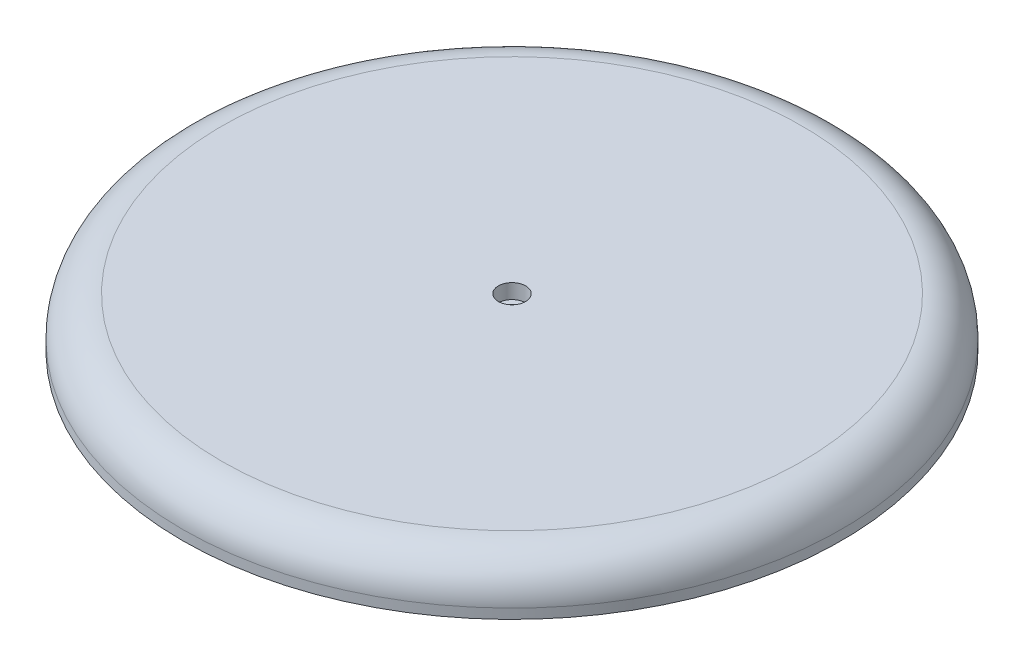
ISO-10303-21;
HEADER;
FILE_DESCRIPTION(('STEP AP214'),'2;1');
FILE_NAME('part.step','',(''),(''),'','','');
FILE_SCHEMA(('AUTOMOTIVE_DESIGN { 1 0 10303 214 1 1 1 1 }'));
ENDSEC;
DATA;
#1=APPLICATION_CONTEXT('core data for automotive mechanical design processes');
#2=APPLICATION_PROTOCOL_DEFINITION('international standard','automotive_design',2000,#1);
#3=PRODUCT_CONTEXT('',#1,'mechanical');
#4=PRODUCT('Part','Part','',(#3));
#5=PRODUCT_RELATED_PRODUCT_CATEGORY('part','',(#4));
#6=PRODUCT_DEFINITION_FORMATION('','',#4);
#7=PRODUCT_DEFINITION_CONTEXT('part definition',#1,'design');
#8=PRODUCT_DEFINITION('design','',#6,#7);
#9=PRODUCT_DEFINITION_SHAPE('','',#8);
#10=(LENGTH_UNIT() NAMED_UNIT(*) SI_UNIT(.MILLI.,.METRE.));
#11=(NAMED_UNIT(*) PLANE_ANGLE_UNIT() SI_UNIT($,.RADIAN.));
#12=(NAMED_UNIT(*) SI_UNIT($,.STERADIAN.) SOLID_ANGLE_UNIT());
#13=UNCERTAINTY_MEASURE_WITH_UNIT(LENGTH_MEASURE(1.E-05),#10,'distance_accuracy_value','');
#14=(GEOMETRIC_REPRESENTATION_CONTEXT(3) GLOBAL_UNCERTAINTY_ASSIGNED_CONTEXT((#13)) GLOBAL_UNIT_ASSIGNED_CONTEXT((#10,
#11,#12)) REPRESENTATION_CONTEXT('',''));
#15=CARTESIAN_POINT('',(0.,0.,0.));
#16=DIRECTION('',(0.,0.,1.));
#17=DIRECTION('',(1.,0.,0.));
#18=AXIS2_PLACEMENT_3D('',#15,#16,#17);
#19=CARTESIAN_POINT('',(0.,10.,0.));
#20=DIRECTION('',(0.,-1.,0.));
#21=DIRECTION('',(0.,0.,-1.));
#22=AXIS2_PLACEMENT_3D('',#19,#20,#21);
#23=CYLINDRICAL_SURFACE('',#22,67.15);
#24=CARTESIAN_POINT('',(0.,2.,0.));
#25=DIRECTION('',(0.,1.,0.));
#26=DIRECTION('',(0.,0.,1.));
#27=AXIS2_PLACEMENT_3D('',#24,#25,#26);
#28=CIRCLE('',#27,67.15);
#29=CARTESIAN_POINT('',(0.,2.,67.15));
#30=VERTEX_POINT('',#29);
#31=EDGE_CURVE('E10',#30,#30,#28,.F.);
#32=ORIENTED_EDGE('',*,*,#31,.T.);
#33=EDGE_LOOP('',(#32));
#34=FACE_BOUND('',#33,.T.);
#35=CARTESIAN_POINT('',(0.,0.,0.));
#36=DIRECTION('',(0.,1.,0.));
#37=DIRECTION('',(0.,0.,1.));
#38=AXIS2_PLACEMENT_3D('',#35,#36,#37);
#39=CIRCLE('',#38,67.15);
#40=CARTESIAN_POINT('',(0.,0.,67.15));
#41=VERTEX_POINT('',#40);
#42=EDGE_CURVE('E50',#41,#41,#39,.T.);
#43=ORIENTED_EDGE('',*,*,#42,.T.);
#44=EDGE_LOOP('',(#43));
#45=FACE_BOUND('',#44,.T.);
#46=ADVANCED_FACE('F37',(#34,#45),#23,.T.);
#47=CARTESIAN_POINT('',(0.,10.,0.));
#48=DIRECTION('',(0.,1.,0.));
#49=DIRECTION('',(0.,0.,1.));
#50=AXIS2_PLACEMENT_3D('',#47,#48,#49);
#51=PLANE('',#50);
#52=CARTESIAN_POINT('',(0.,10.,0.));
#53=DIRECTION('',(0.,1.,0.));
#54=DIRECTION('',(0.,0.,1.));
#55=AXIS2_PLACEMENT_3D('',#52,#53,#54);
#56=CIRCLE('',#55,2.775);
#57=CARTESIAN_POINT('',(0.,10.,2.775));
#58=VERTEX_POINT('',#57);
#59=EDGE_CURVE('E66',#58,#58,#56,.T.);
#60=ORIENTED_EDGE('',*,*,#59,.F.);
#61=EDGE_LOOP('',(#60));
#62=FACE_BOUND('',#61,.T.);
#63=CARTESIAN_POINT('',(0.,10.,0.));
#64=DIRECTION('',(0.,1.,0.));
#65=DIRECTION('',(0.,0.,1.));
#66=AXIS2_PLACEMENT_3D('',#63,#64,#65);
#67=CIRCLE('',#66,59.15);
#68=CARTESIAN_POINT('',(0.,10.,59.15));
#69=VERTEX_POINT('',#68);
#70=EDGE_CURVE('E45',#69,#69,#67,.T.);
#71=ORIENTED_EDGE('',*,*,#70,.T.);
#72=EDGE_LOOP('',(#71));
#73=FACE_BOUND('',#72,.T.);
#74=ADVANCED_FACE('F97',(#62,#73),#51,.T.);
#75=CARTESIAN_POINT('',(0.,0.,0.));
#76=DIRECTION('',(0.,1.,0.));
#77=DIRECTION('',(0.,0.,1.));
#78=AXIS2_PLACEMENT_3D('',#75,#76,#77);
#79=PLANE('',#78);
#80=CARTESIAN_POINT('',(0.,0.,0.));
#81=DIRECTION('',(0.,1.,0.));
#82=DIRECTION('',(0.,0.,1.));
#83=AXIS2_PLACEMENT_3D('',#80,#81,#82);
#84=CIRCLE('',#83,30.48);
#85=CARTESIAN_POINT('',(0.,0.,30.48));
#86=VERTEX_POINT('',#85);
#87=EDGE_CURVE('E58',#86,#86,#84,.T.);
#88=ORIENTED_EDGE('',*,*,#87,.T.);
#89=EDGE_LOOP('',(#88));
#90=FACE_BOUND('',#89,.T.);
#91=ORIENTED_EDGE('',*,*,#42,.F.);
#92=EDGE_LOOP('',(#91));
#93=FACE_BOUND('',#92,.T.);
#94=ADVANCED_FACE('F99',(#90,#93),#79,.F.);
#95=CARTESIAN_POINT('',(0.,-2.,0.));
#96=DIRECTION('',(0.,1.,0.));
#97=DIRECTION('',(0.,0.,1.));
#98=AXIS2_PLACEMENT_3D('',#95,#96,#97);
#99=CYLINDRICAL_SURFACE('',#98,30.48);
#100=CARTESIAN_POINT('',(0.,-2.,0.));
#101=DIRECTION('',(0.,1.,0.));
#102=DIRECTION('',(0.,0.,1.));
#103=AXIS2_PLACEMENT_3D('',#100,#101,#102);
#104=CIRCLE('',#103,30.48);
#105=CARTESIAN_POINT('',(0.,-2.,30.48));
#106=VERTEX_POINT('',#105);
#107=EDGE_CURVE('E55',#106,#106,#104,.T.);
#108=ORIENTED_EDGE('',*,*,#107,.T.);
#109=EDGE_LOOP('',(#108));
#110=FACE_BOUND('',#109,.T.);
#111=ORIENTED_EDGE('',*,*,#87,.F.);
#112=EDGE_LOOP('',(#111));
#113=FACE_BOUND('',#112,.T.);
#114=ADVANCED_FACE('F105',(#110,#113),#99,.T.);
#115=CARTESIAN_POINT('',(0.,-2.,0.));
#116=DIRECTION('',(0.,1.,0.));
#117=DIRECTION('',(0.,0.,1.));
#118=AXIS2_PLACEMENT_3D('',#115,#116,#117);
#119=PLANE('',#118);
#120=CARTESIAN_POINT('',(0.,-2.,0.));
#121=DIRECTION('',(0.,1.,0.));
#122=DIRECTION('',(0.,0.,1.));
#123=AXIS2_PLACEMENT_3D('',#120,#121,#122);
#124=CIRCLE('',#123,1.6);
#125=CARTESIAN_POINT('',(0.,-2.,1.6));
#126=VERTEX_POINT('',#125);
#127=EDGE_CURVE('E70',#126,#126,#124,.F.);
#128=ORIENTED_EDGE('',*,*,#127,.F.);
#129=EDGE_LOOP('',(#128));
#130=FACE_BOUND('',#129,.T.);
#131=ORIENTED_EDGE('',*,*,#107,.F.);
#132=EDGE_LOOP('',(#131));
#133=FACE_BOUND('',#132,.T.);
#134=ADVANCED_FACE('F111',(#130,#133),#119,.F.);
#135=CARTESIAN_POINT('',(0.,2.,0.));
#136=DIRECTION('',(0.,1.,0.));
#137=DIRECTION('',(0.,0.,1.));
#138=AXIS2_PLACEMENT_3D('',#135,#136,#137);
#139=TOROIDAL_SURFACE('',#138,59.15,8.);
#140=ORIENTED_EDGE('',*,*,#31,.F.);
#141=EDGE_LOOP('',(#140));
#142=FACE_BOUND('',#141,.T.);
#143=ORIENTED_EDGE('',*,*,#70,.F.);
#144=EDGE_LOOP('',(#143));
#145=FACE_BOUND('',#144,.T.);
#146=ADVANCED_FACE('F39',(#142,#145),#139,.T.);
#147=CARTESIAN_POINT('',(0.,7.,0.));
#148=DIRECTION('',(0.,1.,0.));
#149=DIRECTION('',(0.,0.,1.));
#150=AXIS2_PLACEMENT_3D('',#147,#148,#149);
#151=CYLINDRICAL_SURFACE('',#150,2.775);
#152=CARTESIAN_POINT('',(0.,7.,0.));
#153=DIRECTION('',(0.,1.,0.));
#154=DIRECTION('',(0.,0.,1.));
#155=AXIS2_PLACEMENT_3D('',#152,#153,#154);
#156=CIRCLE('',#155,2.775);
#157=CARTESIAN_POINT('',(0.,7.,2.775));
#158=VERTEX_POINT('',#157);
#159=EDGE_CURVE('E62',#158,#158,#156,.T.);
#160=ORIENTED_EDGE('',*,*,#159,.F.);
#161=EDGE_LOOP('',(#160));
#162=FACE_BOUND('',#161,.T.);
#163=ORIENTED_EDGE('',*,*,#59,.T.);
#164=EDGE_LOOP('',(#163));
#165=FACE_BOUND('',#164,.T.);
#166=ADVANCED_FACE('F88',(#162,#165),#151,.F.);
#167=CARTESIAN_POINT('',(0.,7.,0.));
#168=DIRECTION('',(0.,1.,0.));
#169=DIRECTION('',(0.,0.,1.));
#170=AXIS2_PLACEMENT_3D('',#167,#168,#169);
#171=PLANE('',#170);
#172=CARTESIAN_POINT('',(0.,7.,0.));
#173=DIRECTION('',(0.,1.,0.));
#174=DIRECTION('',(0.,0.,1.));
#175=AXIS2_PLACEMENT_3D('',#172,#173,#174);
#176=CIRCLE('',#175,1.6);
#177=CARTESIAN_POINT('',(0.,7.,1.6));
#178=VERTEX_POINT('',#177);
#179=EDGE_CURVE('E77',#178,#178,#176,.T.);
#180=ORIENTED_EDGE('',*,*,#179,.F.);
#181=EDGE_LOOP('',(#180));
#182=FACE_BOUND('',#181,.T.);
#183=ORIENTED_EDGE('',*,*,#159,.T.);
#184=EDGE_LOOP('',(#183));
#185=FACE_BOUND('',#184,.T.);
#186=ADVANCED_FACE('F85',(#182,#185),#171,.T.);
#187=CARTESIAN_POINT('',(0.,-2.001,0.));
#188=DIRECTION('',(0.,1.,0.));
#189=DIRECTION('',(0.,0.,1.));
#190=AXIS2_PLACEMENT_3D('',#187,#188,#189);
#191=CYLINDRICAL_SURFACE('',#190,1.6);
#192=ORIENTED_EDGE('',*,*,#179,.T.);
#193=EDGE_LOOP('',(#192));
#194=FACE_BOUND('',#193,.T.);
#195=ORIENTED_EDGE('',*,*,#127,.T.);
#196=EDGE_LOOP('',(#195));
#197=FACE_BOUND('',#196,.T.);
#198=ADVANCED_FACE('F82',(#194,#197),#191,.F.);
#199=CLOSED_SHELL('',(#46,#74,#94,#114,#134,#146,#166,#186,#198));
#200=MANIFOLD_SOLID_BREP('B2',#199);
#201=ADVANCED_BREP_SHAPE_REPRESENTATION('',(#18,#200),#14);
#202=SHAPE_DEFINITION_REPRESENTATION(#9,#201);
ENDSEC;
END-ISO-10303-21;
